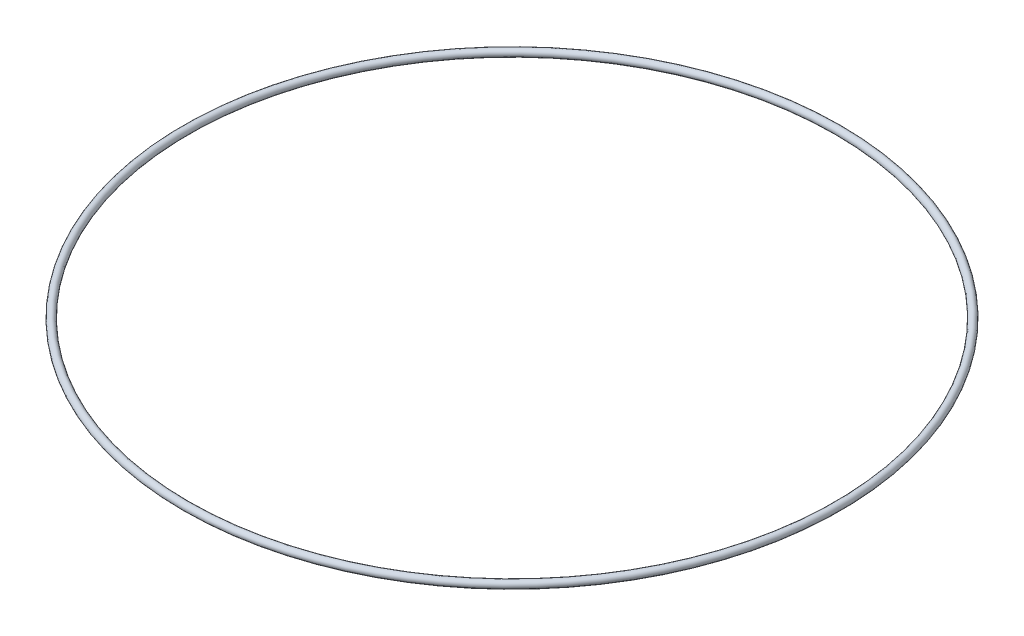
ISO-10303-21;
HEADER;
FILE_DESCRIPTION(('STEP AP214'),'2;1');
FILE_NAME('part.step','',(''),(''),'','','');
FILE_SCHEMA(('AUTOMOTIVE_DESIGN { 1 0 10303 214 1 1 1 1 }'));
ENDSEC;
DATA;
#1=APPLICATION_CONTEXT('core data for automotive mechanical design processes');
#2=APPLICATION_PROTOCOL_DEFINITION('international standard','automotive_design',2000,#1);
#3=PRODUCT_CONTEXT('',#1,'mechanical');
#4=PRODUCT('Part','Part','',(#3));
#5=PRODUCT_RELATED_PRODUCT_CATEGORY('part','',(#4));
#6=PRODUCT_DEFINITION_FORMATION('','',#4);
#7=PRODUCT_DEFINITION_CONTEXT('part definition',#1,'design');
#8=PRODUCT_DEFINITION('design','',#6,#7);
#9=PRODUCT_DEFINITION_SHAPE('','',#8);
#10=(LENGTH_UNIT() NAMED_UNIT(*) SI_UNIT(.MILLI.,.METRE.));
#11=(NAMED_UNIT(*) PLANE_ANGLE_UNIT() SI_UNIT($,.RADIAN.));
#12=(NAMED_UNIT(*) SI_UNIT($,.STERADIAN.) SOLID_ANGLE_UNIT());
#13=UNCERTAINTY_MEASURE_WITH_UNIT(LENGTH_MEASURE(1.E-05),#10,'distance_accuracy_value','');
#14=(GEOMETRIC_REPRESENTATION_CONTEXT(3) GLOBAL_UNCERTAINTY_ASSIGNED_CONTEXT((#13)) GLOBAL_UNIT_ASSIGNED_CONTEXT((#10,
#11,#12)) REPRESENTATION_CONTEXT('',''));
#15=CARTESIAN_POINT('',(0.,0.,0.));
#16=DIRECTION('',(0.,0.,1.));
#17=DIRECTION('',(1.,0.,0.));
#18=AXIS2_PLACEMENT_3D('',#15,#16,#17);
#19=CARTESIAN_POINT('',(0.,0.,0.));
#20=DIRECTION('',(0.,-1.,0.));
#21=DIRECTION('',(0.,0.,-1.));
#22=AXIS2_PLACEMENT_3D('',#19,#20,#21);
#23=TOROIDAL_SURFACE('',#22,220.,2.50000000000002);
#24=CARTESIAN_POINT('',(0.,0.,-222.5));
#25=VERTEX_POINT('',#24);
#26=VERTEX_LOOP('',#25);
#27=FACE_BOUND('',#26,.T.);
#28=ADVANCED_FACE('F29',(#27),#23,.T.);
#29=CLOSED_SHELL('',(#28));
#30=MANIFOLD_SOLID_BREP('B2',#29);
#31=ADVANCED_BREP_SHAPE_REPRESENTATION('',(#18,#30),#14);
#32=SHAPE_DEFINITION_REPRESENTATION(#9,#31);
ENDSEC;
END-ISO-10303-21;
